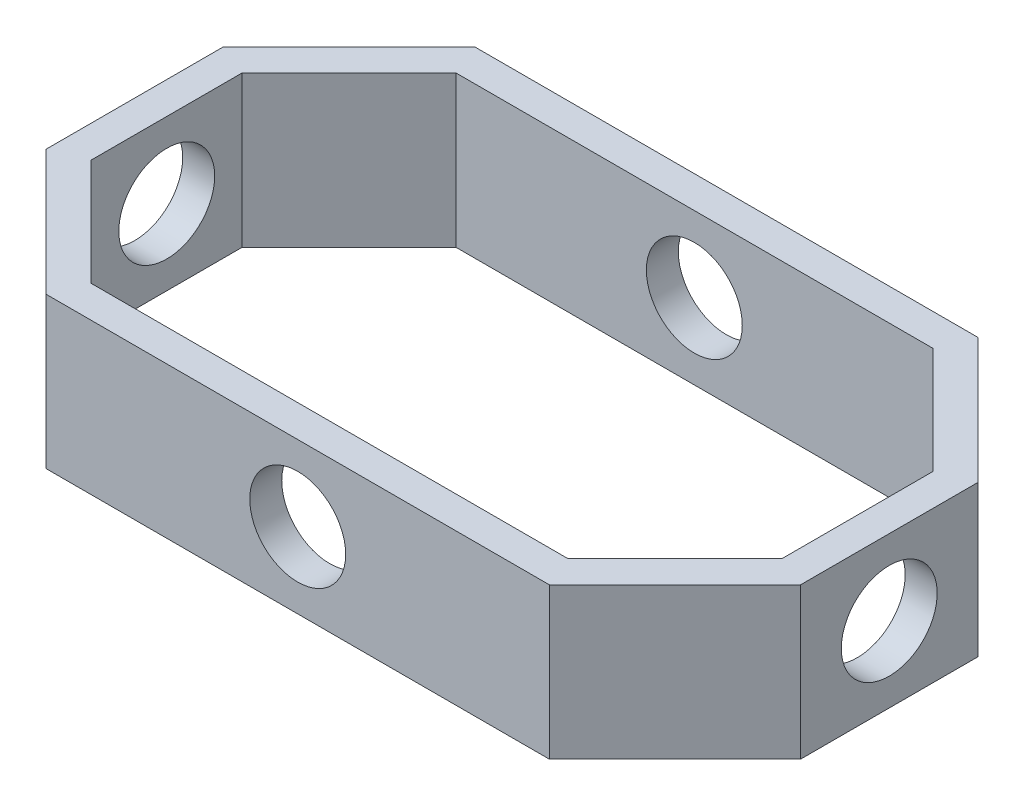
ISO-10303-21;
HEADER;
FILE_DESCRIPTION(('STEP AP214'),'2;1');
FILE_NAME('part.step','',(''),(''),'','','');
FILE_SCHEMA(('AUTOMOTIVE_DESIGN { 1 0 10303 214 1 1 1 1 }'));
ENDSEC;
DATA;
#1=APPLICATION_CONTEXT('core data for automotive mechanical design processes');
#2=APPLICATION_PROTOCOL_DEFINITION('international standard','automotive_design',2000,#1);
#3=PRODUCT_CONTEXT('',#1,'mechanical');
#4=PRODUCT('Part','Part','',(#3));
#5=PRODUCT_RELATED_PRODUCT_CATEGORY('part','',(#4));
#6=PRODUCT_DEFINITION_FORMATION('','',#4);
#7=PRODUCT_DEFINITION_CONTEXT('part definition',#1,'design');
#8=PRODUCT_DEFINITION('design','',#6,#7);
#9=PRODUCT_DEFINITION_SHAPE('','',#8);
#10=(LENGTH_UNIT() NAMED_UNIT(*) SI_UNIT(.MILLI.,.METRE.));
#11=(NAMED_UNIT(*) PLANE_ANGLE_UNIT() SI_UNIT($,.RADIAN.));
#12=(NAMED_UNIT(*) SI_UNIT($,.STERADIAN.) SOLID_ANGLE_UNIT());
#13=UNCERTAINTY_MEASURE_WITH_UNIT(LENGTH_MEASURE(1.E-05),#10,'distance_accuracy_value','');
#14=(GEOMETRIC_REPRESENTATION_CONTEXT(3) GLOBAL_UNCERTAINTY_ASSIGNED_CONTEXT((#13)) GLOBAL_UNIT_ASSIGNED_CONTEXT((#10,
#11,#12)) REPRESENTATION_CONTEXT('',''));
#15=CARTESIAN_POINT('',(0.,0.,0.));
#16=DIRECTION('',(0.,0.,1.));
#17=DIRECTION('',(1.,0.,0.));
#18=AXIS2_PLACEMENT_3D('',#15,#16,#17);
#19=CARTESIAN_POINT('',(0.,15.,0.));
#20=DIRECTION('',(0.,1.,0.));
#21=DIRECTION('',(0.,0.,1.));
#22=AXIS2_PLACEMENT_3D('',#19,#20,#21);
#23=PLANE('',#22);
#24=DIRECTION('',(-0.707106781186547,0.,0.707106781186548));
#25=VECTOR('',#24,1.);
#26=CARTESIAN_POINT('',(-25.,15.,-21.2816017177982));
#27=LINE('',#26,#25);
#28=CARTESIAN_POINT('',(-25.,15.,-21.2816017177982));
#29=VERTEX_POINT('',#28);
#30=CARTESIAN_POINT('',(-37.4664736572636,15.,-8.81512806053457));
#31=VERTEX_POINT('',#30);
#32=EDGE_CURVE('E244',#29,#31,#27,.T.);
#33=ORIENTED_EDGE('',*,*,#32,.T.);
#34=DIRECTION('',(0.,0.,1.));
#35=VECTOR('',#34,1.);
#36=CARTESIAN_POINT('',(-37.4664736572636,15.,-8.81512806053457));
#37=LINE('',#36,#35);
#38=CARTESIAN_POINT('',(-37.4664736572636,15.,8.81512806053458));
#39=VERTEX_POINT('',#38);
#40=EDGE_CURVE('E248',#31,#39,#37,.T.);
#41=ORIENTED_EDGE('',*,*,#40,.T.);
#42=DIRECTION('',(0.707106781186548,0.,0.707106781186547));
#43=VECTOR('',#42,1.);
#44=CARTESIAN_POINT('',(-37.4664736572636,15.,8.81512806053458));
#45=LINE('',#44,#43);
#46=CARTESIAN_POINT('',(-25.,15.,21.2816017177982));
#47=VERTEX_POINT('',#46);
#48=EDGE_CURVE('E252',#39,#47,#45,.T.);
#49=ORIENTED_EDGE('',*,*,#48,.T.);
#50=DIRECTION('',(1.,0.,0.));
#51=VECTOR('',#50,1.);
#52=CARTESIAN_POINT('',(-25.,15.,21.2816017177982));
#53=LINE('',#52,#51);
#54=CARTESIAN_POINT('',(25.,15.,21.2816017177982));
#55=VERTEX_POINT('',#54);
#56=EDGE_CURVE('E255',#47,#55,#53,.T.);
#57=ORIENTED_EDGE('',*,*,#56,.T.);
#58=DIRECTION('',(0.707106781186548,0.,-0.707106781186547));
#59=VECTOR('',#58,1.);
#60=CARTESIAN_POINT('',(25.,15.,21.2816017177982));
#61=LINE('',#60,#59);
#62=CARTESIAN_POINT('',(37.4664736572636,15.,8.81512806053457));
#63=VERTEX_POINT('',#62);
#64=EDGE_CURVE('E258',#55,#63,#61,.T.);
#65=ORIENTED_EDGE('',*,*,#64,.T.);
#66=DIRECTION('',(0.,0.,-1.));
#67=VECTOR('',#66,1.);
#68=CARTESIAN_POINT('',(37.4664736572636,15.,8.81512806053457));
#69=LINE('',#68,#67);
#70=CARTESIAN_POINT('',(37.4664736572636,15.,-8.81512806053457));
#71=VERTEX_POINT('',#70);
#72=EDGE_CURVE('E261',#63,#71,#69,.T.);
#73=ORIENTED_EDGE('',*,*,#72,.T.);
#74=DIRECTION('',(-0.707106781186548,0.,-0.707106781186547));
#75=VECTOR('',#74,1.);
#76=CARTESIAN_POINT('',(37.4664736572636,15.,-8.81512806053457));
#77=LINE('',#76,#75);
#78=CARTESIAN_POINT('',(25.,15.,-21.2816017177982));
#79=VERTEX_POINT('',#78);
#80=EDGE_CURVE('E264',#71,#79,#77,.T.);
#81=ORIENTED_EDGE('',*,*,#80,.T.);
#82=DIRECTION('',(-1.,0.,0.));
#83=VECTOR('',#82,1.);
#84=CARTESIAN_POINT('',(25.,15.,-21.2816017177982));
#85=LINE('',#84,#83);
#86=EDGE_CURVE('E267',#79,#29,#85,.T.);
#87=ORIENTED_EDGE('',*,*,#86,.T.);
#88=EDGE_LOOP('',(#33,#41,#49,#57,#65,#73,#81,#87));
#89=FACE_BOUND('',#88,.T.);
#90=DIRECTION('',(0.707106781186548,0.,0.707106781186547));
#91=VECTOR('',#90,1.);
#92=CARTESIAN_POINT('',(-34.2914736572636,15.,7.5));
#93=LINE('',#92,#91);
#94=CARTESIAN_POINT('',(-34.2914736572636,15.,7.5));
#95=VERTEX_POINT('',#94);
#96=CARTESIAN_POINT('',(-23.6848719394654,15.,18.1066017177982));
#97=VERTEX_POINT('',#96);
#98=EDGE_CURVE('E162',#95,#97,#93,.T.);
#99=ORIENTED_EDGE('',*,*,#98,.F.);
#100=DIRECTION('',(0.,0.,1.));
#101=VECTOR('',#100,1.);
#102=CARTESIAN_POINT('',(-34.2914736572636,15.,-7.49999999999999));
#103=LINE('',#102,#101);
#104=CARTESIAN_POINT('',(-34.2914736572636,15.,-7.49999999999999));
#105=VERTEX_POINT('',#104);
#106=EDGE_CURVE('E153',#105,#95,#103,.T.);
#107=ORIENTED_EDGE('',*,*,#106,.F.);
#108=DIRECTION('',(-0.707106781186547,0.,0.707106781186548));
#109=VECTOR('',#108,1.);
#110=CARTESIAN_POINT('',(-23.6848719394654,15.,-18.1066017177982));
#111=LINE('',#110,#109);
#112=CARTESIAN_POINT('',(-23.6848719394654,15.,-18.1066017177982));
#113=VERTEX_POINT('',#112);
#114=EDGE_CURVE('E195',#113,#105,#111,.T.);
#115=ORIENTED_EDGE('',*,*,#114,.F.);
#116=DIRECTION('',(-1.,0.,0.));
#117=VECTOR('',#116,1.);
#118=CARTESIAN_POINT('',(23.6848719394654,15.,-18.1066017177982));
#119=LINE('',#118,#117);
#120=CARTESIAN_POINT('',(23.6848719394654,15.,-18.1066017177982));
#121=VERTEX_POINT('',#120);
#122=EDGE_CURVE('E192',#121,#113,#119,.T.);
#123=ORIENTED_EDGE('',*,*,#122,.F.);
#124=DIRECTION('',(-0.707106781186548,0.,-0.707106781186547));
#125=VECTOR('',#124,1.);
#126=CARTESIAN_POINT('',(34.2914736572636,15.,-7.49999999999999));
#127=LINE('',#126,#125);
#128=CARTESIAN_POINT('',(34.2914736572636,15.,-7.49999999999999));
#129=VERTEX_POINT('',#128);
#130=EDGE_CURVE('E189',#129,#121,#127,.T.);
#131=ORIENTED_EDGE('',*,*,#130,.F.);
#132=DIRECTION('',(0.,0.,-1.));
#133=VECTOR('',#132,1.);
#134=CARTESIAN_POINT('',(34.2914736572636,15.,7.49999999999999));
#135=LINE('',#134,#133);
#136=CARTESIAN_POINT('',(34.2914736572636,15.,7.49999999999999));
#137=VERTEX_POINT('',#136);
#138=EDGE_CURVE('E186',#137,#129,#135,.T.);
#139=ORIENTED_EDGE('',*,*,#138,.F.);
#140=DIRECTION('',(0.707106781186548,0.,-0.707106781186548));
#141=VECTOR('',#140,1.);
#142=CARTESIAN_POINT('',(23.6848719394654,15.,18.1066017177982));
#143=LINE('',#142,#141);
#144=CARTESIAN_POINT('',(23.6848719394654,15.,18.1066017177982));
#145=VERTEX_POINT('',#144);
#146=EDGE_CURVE('E180',#145,#137,#143,.T.);
#147=ORIENTED_EDGE('',*,*,#146,.F.);
#148=DIRECTION('',(1.,0.,0.));
#149=VECTOR('',#148,1.);
#150=CARTESIAN_POINT('',(-23.6848719394654,15.,18.1066017177982));
#151=LINE('',#150,#149);
#152=EDGE_CURVE('E176',#97,#145,#151,.T.);
#153=ORIENTED_EDGE('',*,*,#152,.F.);
#154=EDGE_LOOP('',(#99,#107,#115,#123,#131,#139,#147,#153));
#155=FACE_BOUND('',#154,.T.);
#156=ADVANCED_FACE('F39',(#89,#155),#23,.T.);
#157=CARTESIAN_POINT('',(0.,0.,0.));
#158=DIRECTION('',(0.,1.,0.));
#159=DIRECTION('',(0.,0.,1.));
#160=AXIS2_PLACEMENT_3D('',#157,#158,#159);
#161=PLANE('',#160);
#162=DIRECTION('',(-0.707106781186547,0.,0.707106781186548));
#163=VECTOR('',#162,1.);
#164=CARTESIAN_POINT('',(-25.,0.,-21.2816017177982));
#165=LINE('',#164,#163);
#166=CARTESIAN_POINT('',(-25.,0.,-21.2816017177982));
#167=VERTEX_POINT('',#166);
#168=CARTESIAN_POINT('',(-37.4664736572636,0.,-8.81512806053457));
#169=VERTEX_POINT('',#168);
#170=EDGE_CURVE('E171',#167,#169,#165,.T.);
#171=ORIENTED_EDGE('',*,*,#170,.F.);
#172=DIRECTION('',(-1.,0.,0.));
#173=VECTOR('',#172,1.);
#174=CARTESIAN_POINT('',(25.,0.,-21.2816017177982));
#175=LINE('',#174,#173);
#176=CARTESIAN_POINT('',(25.,0.,-21.2816017177982));
#177=VERTEX_POINT('',#176);
#178=EDGE_CURVE('E249',#177,#167,#175,.T.);
#179=ORIENTED_EDGE('',*,*,#178,.F.);
#180=DIRECTION('',(-0.707106781186548,0.,-0.707106781186547));
#181=VECTOR('',#180,1.);
#182=CARTESIAN_POINT('',(37.4664736572636,0.,-8.81512806053457));
#183=LINE('',#182,#181);
#184=CARTESIAN_POINT('',(37.4664736572636,0.,-8.81512806053457));
#185=VERTEX_POINT('',#184);
#186=EDGE_CURVE('E289',#185,#177,#183,.T.);
#187=ORIENTED_EDGE('',*,*,#186,.F.);
#188=DIRECTION('',(0.,0.,-1.));
#189=VECTOR('',#188,1.);
#190=CARTESIAN_POINT('',(37.4664736572636,0.,8.81512806053457));
#191=LINE('',#190,#189);
#192=CARTESIAN_POINT('',(37.4664736572636,0.,8.81512806053457));
#193=VERTEX_POINT('',#192);
#194=EDGE_CURVE('E286',#193,#185,#191,.T.);
#195=ORIENTED_EDGE('',*,*,#194,.F.);
#196=DIRECTION('',(0.707106781186548,0.,-0.707106781186547));
#197=VECTOR('',#196,1.);
#198=CARTESIAN_POINT('',(25.,0.,21.2816017177982));
#199=LINE('',#198,#197);
#200=CARTESIAN_POINT('',(25.,0.,21.2816017177982));
#201=VERTEX_POINT('',#200);
#202=EDGE_CURVE('E283',#201,#193,#199,.T.);
#203=ORIENTED_EDGE('',*,*,#202,.F.);
#204=DIRECTION('',(1.,0.,0.));
#205=VECTOR('',#204,1.);
#206=CARTESIAN_POINT('',(-25.,0.,21.2816017177982));
#207=LINE('',#206,#205);
#208=CARTESIAN_POINT('',(-25.,0.,21.2816017177982));
#209=VERTEX_POINT('',#208);
#210=EDGE_CURVE('E280',#209,#201,#207,.T.);
#211=ORIENTED_EDGE('',*,*,#210,.F.);
#212=DIRECTION('',(0.707106781186548,0.,0.707106781186547));
#213=VECTOR('',#212,1.);
#214=CARTESIAN_POINT('',(-37.4664736572636,0.,8.81512806053458));
#215=LINE('',#214,#213);
#216=CARTESIAN_POINT('',(-37.4664736572636,0.,8.81512806053458));
#217=VERTEX_POINT('',#216);
#218=EDGE_CURVE('E277',#217,#209,#215,.T.);
#219=ORIENTED_EDGE('',*,*,#218,.F.);
#220=DIRECTION('',(0.,0.,1.));
#221=VECTOR('',#220,1.);
#222=CARTESIAN_POINT('',(-37.4664736572636,0.,-8.81512806053457));
#223=LINE('',#222,#221);
#224=EDGE_CURVE('E274',#169,#217,#223,.T.);
#225=ORIENTED_EDGE('',*,*,#224,.F.);
#226=EDGE_LOOP('',(#171,#179,#187,#195,#203,#211,#219,#225));
#227=FACE_BOUND('',#226,.T.);
#228=DIRECTION('',(0.,0.,1.));
#229=VECTOR('',#228,1.);
#230=CARTESIAN_POINT('',(-34.2914736572636,0.,-7.49999999999999));
#231=LINE('',#230,#229);
#232=CARTESIAN_POINT('',(-34.2914736572636,0.,-7.5));
#233=VERTEX_POINT('',#232);
#234=CARTESIAN_POINT('',(-34.2914736572636,0.,7.5));
#235=VERTEX_POINT('',#234);
#236=EDGE_CURVE('E63',#233,#235,#231,.T.);
#237=ORIENTED_EDGE('',*,*,#236,.T.);
#238=DIRECTION('',(0.707106781186548,0.,0.707106781186547));
#239=VECTOR('',#238,1.);
#240=CARTESIAN_POINT('',(-34.2914736572636,0.,7.5));
#241=LINE('',#240,#239);
#242=CARTESIAN_POINT('',(-23.6848719394654,0.,18.1066017177982));
#243=VERTEX_POINT('',#242);
#244=EDGE_CURVE('E169',#235,#243,#241,.T.);
#245=ORIENTED_EDGE('',*,*,#244,.T.);
#246=DIRECTION('',(1.,0.,0.));
#247=VECTOR('',#246,1.);
#248=CARTESIAN_POINT('',(-23.6848719394654,0.,18.1066017177982));
#249=LINE('',#248,#247);
#250=CARTESIAN_POINT('',(23.6848719394654,0.,18.1066017177982));
#251=VERTEX_POINT('',#250);
#252=EDGE_CURVE('E203',#243,#251,#249,.T.);
#253=ORIENTED_EDGE('',*,*,#252,.T.);
#254=DIRECTION('',(0.707106781186548,0.,-0.707106781186548));
#255=VECTOR('',#254,1.);
#256=CARTESIAN_POINT('',(23.6848719394654,0.,18.1066017177982));
#257=LINE('',#256,#255);
#258=CARTESIAN_POINT('',(34.2914736572636,0.,7.49999999999999));
#259=VERTEX_POINT('',#258);
#260=EDGE_CURVE('E207',#251,#259,#257,.T.);
#261=ORIENTED_EDGE('',*,*,#260,.T.);
#262=DIRECTION('',(0.,0.,-1.));
#263=VECTOR('',#262,1.);
#264=CARTESIAN_POINT('',(34.2914736572636,0.,7.49999999999999));
#265=LINE('',#264,#263);
#266=CARTESIAN_POINT('',(34.2914736572636,0.,-7.49999999999999));
#267=VERTEX_POINT('',#266);
#268=EDGE_CURVE('E211',#259,#267,#265,.T.);
#269=ORIENTED_EDGE('',*,*,#268,.T.);
#270=DIRECTION('',(-0.707106781186548,0.,-0.707106781186547));
#271=VECTOR('',#270,1.);
#272=CARTESIAN_POINT('',(34.2914736572636,0.,-7.49999999999999));
#273=LINE('',#272,#271);
#274=CARTESIAN_POINT('',(23.6848719394654,0.,-18.1066017177982));
#275=VERTEX_POINT('',#274);
#276=EDGE_CURVE('E215',#267,#275,#273,.T.);
#277=ORIENTED_EDGE('',*,*,#276,.T.);
#278=DIRECTION('',(-1.,0.,0.));
#279=VECTOR('',#278,1.);
#280=CARTESIAN_POINT('',(23.6848719394654,0.,-18.1066017177982));
#281=LINE('',#280,#279);
#282=CARTESIAN_POINT('',(-23.6848719394654,0.,-18.1066017177982));
#283=VERTEX_POINT('',#282);
#284=EDGE_CURVE('E219',#275,#283,#281,.T.);
#285=ORIENTED_EDGE('',*,*,#284,.T.);
#286=DIRECTION('',(-0.707106781186547,0.,0.707106781186548));
#287=VECTOR('',#286,1.);
#288=CARTESIAN_POINT('',(-23.6848719394654,0.,-18.1066017177982));
#289=LINE('',#288,#287);
#290=EDGE_CURVE('E163',#283,#233,#289,.T.);
#291=ORIENTED_EDGE('',*,*,#290,.T.);
#292=EDGE_LOOP('',(#237,#245,#253,#261,#269,#277,#285,#291));
#293=FACE_BOUND('',#292,.T.);
#294=ADVANCED_FACE('F328',(#227,#293),#161,.F.);
#295=CARTESIAN_POINT('',(-25.,15.,-21.2816017177982));
#296=DIRECTION('',(0.707106781186548,0.,0.707106781186547));
#297=DIRECTION('',(0.707106781186547,0.,-0.707106781186548));
#298=AXIS2_PLACEMENT_3D('',#295,#296,#297);
#299=PLANE('',#298);
#300=ORIENTED_EDGE('',*,*,#170,.T.);
#301=DIRECTION('',(0.,-1.,0.));
#302=VECTOR('',#301,1.);
#303=CARTESIAN_POINT('',(-37.4664736572636,15.,-8.81512806053457));
#304=LINE('',#303,#302);
#305=EDGE_CURVE('E11',#31,#169,#304,.T.);
#306=ORIENTED_EDGE('',*,*,#305,.F.);
#307=ORIENTED_EDGE('',*,*,#32,.F.);
#308=DIRECTION('',(0.,-1.,0.));
#309=VECTOR('',#308,1.);
#310=CARTESIAN_POINT('',(-25.,15.,-21.2816017177982));
#311=LINE('',#310,#309);
#312=EDGE_CURVE('E270',#29,#167,#311,.T.);
#313=ORIENTED_EDGE('',*,*,#312,.T.);
#314=EDGE_LOOP('',(#300,#306,#307,#313));
#315=FACE_BOUND('',#314,.T.);
#316=ADVANCED_FACE('F41',(#315),#299,.F.);
#317=CARTESIAN_POINT('',(-37.4664736572636,15.,-8.81512806053457));
#318=DIRECTION('',(1.,0.,0.));
#319=DIRECTION('',(0.,0.,-1.));
#320=AXIS2_PLACEMENT_3D('',#317,#318,#319);
#321=PLANE('',#320);
#322=CARTESIAN_POINT('',(-37.4664736572636,7.5,1.30813493606594E-13));
#323=DIRECTION('',(1.,0.,0.));
#324=DIRECTION('',(0.,0.,-1.));
#325=AXIS2_PLACEMENT_3D('',#322,#323,#324);
#326=CIRCLE('',#325,4.7625);
#327=CARTESIAN_POINT('',(-37.4664736572636,7.5,-4.76249999999987));
#328=VERTEX_POINT('',#327);
#329=EDGE_CURVE('E395',#328,#328,#326,.F.);
#330=ORIENTED_EDGE('',*,*,#329,.F.);
#331=EDGE_LOOP('',(#330));
#332=FACE_BOUND('',#331,.T.);
#333=ORIENTED_EDGE('',*,*,#224,.T.);
#334=DIRECTION('',(0.,-1.,0.));
#335=VECTOR('',#334,1.);
#336=CARTESIAN_POINT('',(-37.4664736572636,15.,8.81512806053458));
#337=LINE('',#336,#335);
#338=EDGE_CURVE('E48',#39,#217,#337,.T.);
#339=ORIENTED_EDGE('',*,*,#338,.F.);
#340=ORIENTED_EDGE('',*,*,#40,.F.);
#341=ORIENTED_EDGE('',*,*,#305,.T.);
#342=EDGE_LOOP('',(#333,#339,#340,#341));
#343=FACE_BOUND('',#342,.T.);
#344=ADVANCED_FACE('F345',(#332,#343),#321,.F.);
#345=CARTESIAN_POINT('',(-37.4664736572636,15.,8.81512806053458));
#346=DIRECTION('',(0.707106781186547,0.,-0.707106781186548));
#347=DIRECTION('',(-0.707106781186548,0.,-0.707106781186547));
#348=AXIS2_PLACEMENT_3D('',#345,#346,#347);
#349=PLANE('',#348);
#350=ORIENTED_EDGE('',*,*,#218,.T.);
#351=DIRECTION('',(0.,-1.,0.));
#352=VECTOR('',#351,1.);
#353=CARTESIAN_POINT('',(-25.,15.,21.2816017177982));
#354=LINE('',#353,#352);
#355=EDGE_CURVE('E313',#47,#209,#354,.T.);
#356=ORIENTED_EDGE('',*,*,#355,.F.);
#357=ORIENTED_EDGE('',*,*,#48,.F.);
#358=ORIENTED_EDGE('',*,*,#338,.T.);
#359=EDGE_LOOP('',(#350,#356,#357,#358));
#360=FACE_BOUND('',#359,.T.);
#361=ADVANCED_FACE('F322',(#360),#349,.F.);
#362=CARTESIAN_POINT('',(-25.,15.,21.2816017177982));
#363=DIRECTION('',(0.,0.,-1.));
#364=DIRECTION('',(-1.,0.,0.));
#365=AXIS2_PLACEMENT_3D('',#362,#363,#364);
#366=PLANE('',#365);
#367=CARTESIAN_POINT('',(0.,7.5,21.2816017177982));
#368=DIRECTION('',(0.,0.,1.));
#369=DIRECTION('',(1.,0.,0.));
#370=AXIS2_PLACEMENT_3D('',#367,#368,#369);
#371=CIRCLE('',#370,4.7625);
#372=CARTESIAN_POINT('',(4.7625,7.5,21.2816017177982));
#373=VERTEX_POINT('',#372);
#374=EDGE_CURVE('E200',#373,#373,#371,.T.);
#375=ORIENTED_EDGE('',*,*,#374,.F.);
#376=EDGE_LOOP('',(#375));
#377=FACE_BOUND('',#376,.T.);
#378=ORIENTED_EDGE('',*,*,#210,.T.);
#379=DIRECTION('',(0.,-1.,0.));
#380=VECTOR('',#379,1.);
#381=CARTESIAN_POINT('',(25.,15.,21.2816017177982));
#382=LINE('',#381,#380);
#383=EDGE_CURVE('E309',#55,#201,#382,.T.);
#384=ORIENTED_EDGE('',*,*,#383,.F.);
#385=ORIENTED_EDGE('',*,*,#56,.F.);
#386=ORIENTED_EDGE('',*,*,#355,.T.);
#387=EDGE_LOOP('',(#378,#384,#385,#386));
#388=FACE_BOUND('',#387,.T.);
#389=ADVANCED_FACE('F334',(#377,#388),#366,.F.);
#390=CARTESIAN_POINT('',(25.,15.,21.2816017177982));
#391=DIRECTION('',(-0.707106781186547,0.,-0.707106781186548));
#392=DIRECTION('',(-0.707106781186548,0.,0.707106781186547));
#393=AXIS2_PLACEMENT_3D('',#390,#391,#392);
#394=PLANE('',#393);
#395=ORIENTED_EDGE('',*,*,#202,.T.);
#396=DIRECTION('',(0.,-1.,0.));
#397=VECTOR('',#396,1.);
#398=CARTESIAN_POINT('',(37.4664736572636,15.,8.81512806053457));
#399=LINE('',#398,#397);
#400=EDGE_CURVE('E305',#63,#193,#399,.T.);
#401=ORIENTED_EDGE('',*,*,#400,.F.);
#402=ORIENTED_EDGE('',*,*,#64,.F.);
#403=ORIENTED_EDGE('',*,*,#383,.T.);
#404=EDGE_LOOP('',(#395,#401,#402,#403));
#405=FACE_BOUND('',#404,.T.);
#406=ADVANCED_FACE('F338',(#405),#394,.F.);
#407=CARTESIAN_POINT('',(37.4664736572636,15.,8.81512806053457));
#408=DIRECTION('',(-1.,0.,0.));
#409=DIRECTION('',(0.,0.,1.));
#410=AXIS2_PLACEMENT_3D('',#407,#408,#409);
#411=PLANE('',#410);
#412=CARTESIAN_POINT('',(37.4664736572636,7.5,-3.92440480819781E-13));
#413=DIRECTION('',(-1.,0.,0.));
#414=DIRECTION('',(0.,0.,1.));
#415=AXIS2_PLACEMENT_3D('',#412,#413,#414);
#416=CIRCLE('',#415,4.7625);
#417=CARTESIAN_POINT('',(37.4664736572636,7.5,4.76249999999961));
#418=VERTEX_POINT('',#417);
#419=EDGE_CURVE('E398',#418,#418,#416,.F.);
#420=ORIENTED_EDGE('',*,*,#419,.F.);
#421=EDGE_LOOP('',(#420));
#422=FACE_BOUND('',#421,.T.);
#423=ORIENTED_EDGE('',*,*,#194,.T.);
#424=DIRECTION('',(0.,-1.,0.));
#425=VECTOR('',#424,1.);
#426=CARTESIAN_POINT('',(37.4664736572636,15.,-8.81512806053457));
#427=LINE('',#426,#425);
#428=EDGE_CURVE('E301',#71,#185,#427,.T.);
#429=ORIENTED_EDGE('',*,*,#428,.F.);
#430=ORIENTED_EDGE('',*,*,#72,.F.);
#431=ORIENTED_EDGE('',*,*,#400,.T.);
#432=EDGE_LOOP('',(#423,#429,#430,#431));
#433=FACE_BOUND('',#432,.T.);
#434=ADVANCED_FACE('F358',(#422,#433),#411,.F.);
#435=CARTESIAN_POINT('',(37.4664736572636,15.,-8.81512806053457));
#436=DIRECTION('',(-0.707106781186547,0.,0.707106781186548));
#437=DIRECTION('',(0.707106781186548,0.,0.707106781186547));
#438=AXIS2_PLACEMENT_3D('',#435,#436,#437);
#439=PLANE('',#438);
#440=ORIENTED_EDGE('',*,*,#186,.T.);
#441=DIRECTION('',(0.,-1.,0.));
#442=VECTOR('',#441,1.);
#443=CARTESIAN_POINT('',(25.,15.,-21.2816017177982));
#444=LINE('',#443,#442);
#445=EDGE_CURVE('E297',#79,#177,#444,.T.);
#446=ORIENTED_EDGE('',*,*,#445,.F.);
#447=ORIENTED_EDGE('',*,*,#80,.F.);
#448=ORIENTED_EDGE('',*,*,#428,.T.);
#449=EDGE_LOOP('',(#440,#446,#447,#448));
#450=FACE_BOUND('',#449,.T.);
#451=ADVANCED_FACE('F356',(#450),#439,.F.);
#452=CARTESIAN_POINT('',(25.,15.,-21.2816017177982));
#453=DIRECTION('',(0.,0.,1.));
#454=DIRECTION('',(1.,0.,0.));
#455=AXIS2_PLACEMENT_3D('',#452,#453,#454);
#456=PLANE('',#455);
#457=CARTESIAN_POINT('',(0.,7.5,-21.2816017177982));
#458=DIRECTION('',(0.,0.,-1.));
#459=DIRECTION('',(-1.,0.,0.));
#460=AXIS2_PLACEMENT_3D('',#457,#458,#459);
#461=CIRCLE('',#460,4.7625);
#462=CARTESIAN_POINT('',(-4.7625,7.5,-21.2816017177982));
#463=VERTEX_POINT('',#462);
#464=EDGE_CURVE('E386',#463,#463,#461,.T.);
#465=ORIENTED_EDGE('',*,*,#464,.F.);
#466=EDGE_LOOP('',(#465));
#467=FACE_BOUND('',#466,.T.);
#468=ORIENTED_EDGE('',*,*,#178,.T.);
#469=ORIENTED_EDGE('',*,*,#312,.F.);
#470=ORIENTED_EDGE('',*,*,#86,.F.);
#471=ORIENTED_EDGE('',*,*,#445,.T.);
#472=EDGE_LOOP('',(#468,#469,#470,#471));
#473=FACE_BOUND('',#472,.T.);
#474=ADVANCED_FACE('F351',(#467,#473),#456,.F.);
#475=CARTESIAN_POINT('',(-34.2914736572636,15.,-7.49999999999999));
#476=DIRECTION('',(1.,0.,0.));
#477=DIRECTION('',(0.,0.,-1.));
#478=AXIS2_PLACEMENT_3D('',#475,#476,#477);
#479=PLANE('',#478);
#480=CARTESIAN_POINT('',(-34.2914736572636,7.5,1.19728040355767E-13));
#481=DIRECTION('',(1.,0.,0.));
#482=DIRECTION('',(0.,0.,-1.));
#483=AXIS2_PLACEMENT_3D('',#480,#481,#482);
#484=CIRCLE('',#483,4.7625);
#485=CARTESIAN_POINT('',(-34.2914736572636,7.5,-4.76249999999988));
#486=VERTEX_POINT('',#485);
#487=EDGE_CURVE('E389',#486,#486,#484,.F.);
#488=ORIENTED_EDGE('',*,*,#487,.T.);
#489=EDGE_LOOP('',(#488));
#490=FACE_BOUND('',#489,.T.);
#491=ORIENTED_EDGE('',*,*,#236,.F.);
#492=DIRECTION('',(0.,-1.,0.));
#493=VECTOR('',#492,1.);
#494=CARTESIAN_POINT('',(-34.2914736572636,15.,-7.49999999999999));
#495=LINE('',#494,#493);
#496=EDGE_CURVE('E157',#105,#233,#495,.T.);
#497=ORIENTED_EDGE('',*,*,#496,.F.);
#498=ORIENTED_EDGE('',*,*,#106,.T.);
#499=DIRECTION('',(0.,-1.,0.));
#500=VECTOR('',#499,1.);
#501=CARTESIAN_POINT('',(-34.2914736572636,15.,7.5));
#502=LINE('',#501,#500);
#503=EDGE_CURVE('E156',#95,#235,#502,.T.);
#504=ORIENTED_EDGE('',*,*,#503,.T.);
#505=EDGE_LOOP('',(#491,#497,#498,#504));
#506=FACE_BOUND('',#505,.T.);
#507=ADVANCED_FACE('F155',(#490,#506),#479,.T.);
#508=CARTESIAN_POINT('',(-34.2914736572636,15.,7.5));
#509=DIRECTION('',(0.707106781186547,0.,-0.707106781186548));
#510=DIRECTION('',(-0.707106781186548,0.,-0.707106781186547));
#511=AXIS2_PLACEMENT_3D('',#508,#509,#510);
#512=PLANE('',#511);
#513=ORIENTED_EDGE('',*,*,#244,.F.);
#514=ORIENTED_EDGE('',*,*,#503,.F.);
#515=ORIENTED_EDGE('',*,*,#98,.T.);
#516=DIRECTION('',(0.,-1.,0.));
#517=VECTOR('',#516,1.);
#518=CARTESIAN_POINT('',(-23.6848719394654,15.,18.1066017177982));
#519=LINE('',#518,#517);
#520=EDGE_CURVE('E172',#97,#243,#519,.T.);
#521=ORIENTED_EDGE('',*,*,#520,.T.);
#522=EDGE_LOOP('',(#513,#514,#515,#521));
#523=FACE_BOUND('',#522,.T.);
#524=ADVANCED_FACE('F166',(#523),#512,.T.);
#525=CARTESIAN_POINT('',(-23.6848719394654,15.,18.1066017177982));
#526=DIRECTION('',(0.,0.,-1.));
#527=DIRECTION('',(-1.,0.,0.));
#528=AXIS2_PLACEMENT_3D('',#525,#526,#527);
#529=PLANE('',#528);
#530=CARTESIAN_POINT('',(0.,7.5,18.1066017177982));
#531=DIRECTION('',(0.,0.,-1.));
#532=DIRECTION('',(-1.,0.,0.));
#533=AXIS2_PLACEMENT_3D('',#530,#531,#532);
#534=CIRCLE('',#533,4.7625);
#535=CARTESIAN_POINT('',(-4.7625,7.5,18.1066017177982));
#536=VERTEX_POINT('',#535);
#537=EDGE_CURVE('E409',#536,#536,#534,.F.);
#538=ORIENTED_EDGE('',*,*,#537,.T.);
#539=EDGE_LOOP('',(#538));
#540=FACE_BOUND('',#539,.T.);
#541=ORIENTED_EDGE('',*,*,#252,.F.);
#542=ORIENTED_EDGE('',*,*,#520,.F.);
#543=ORIENTED_EDGE('',*,*,#152,.T.);
#544=DIRECTION('',(0.,-1.,0.));
#545=VECTOR('',#544,1.);
#546=CARTESIAN_POINT('',(23.6848719394654,15.,18.1066017177982));
#547=LINE('',#546,#545);
#548=EDGE_CURVE('E239',#145,#251,#547,.T.);
#549=ORIENTED_EDGE('',*,*,#548,.T.);
#550=EDGE_LOOP('',(#541,#542,#543,#549));
#551=FACE_BOUND('',#550,.T.);
#552=ADVANCED_FACE('F470',(#540,#551),#529,.T.);
#553=CARTESIAN_POINT('',(23.6848719394654,15.,18.1066017177982));
#554=DIRECTION('',(-0.707106781186548,0.,-0.707106781186547));
#555=DIRECTION('',(-0.707106781186547,0.,0.707106781186548));
#556=AXIS2_PLACEMENT_3D('',#553,#554,#555);
#557=PLANE('',#556);
#558=ORIENTED_EDGE('',*,*,#260,.F.);
#559=ORIENTED_EDGE('',*,*,#548,.F.);
#560=ORIENTED_EDGE('',*,*,#146,.T.);
#561=DIRECTION('',(0.,-1.,0.));
#562=VECTOR('',#561,1.);
#563=CARTESIAN_POINT('',(34.2914736572636,15.,7.49999999999999));
#564=LINE('',#563,#562);
#565=EDGE_CURVE('E236',#137,#259,#564,.T.);
#566=ORIENTED_EDGE('',*,*,#565,.T.);
#567=EDGE_LOOP('',(#558,#559,#560,#566));
#568=FACE_BOUND('',#567,.T.);
#569=ADVANCED_FACE('F466',(#568),#557,.T.);
#570=CARTESIAN_POINT('',(34.2914736572636,15.,7.49999999999999));
#571=DIRECTION('',(-1.,0.,0.));
#572=DIRECTION('',(0.,0.,1.));
#573=AXIS2_PLACEMENT_3D('',#570,#571,#572);
#574=PLANE('',#573);
#575=CARTESIAN_POINT('',(34.2914736572636,7.5,-3.59184121067301E-13));
#576=DIRECTION('',(-1.,0.,0.));
#577=DIRECTION('',(0.,0.,1.));
#578=AXIS2_PLACEMENT_3D('',#575,#576,#577);
#579=CIRCLE('',#578,4.7625);
#580=CARTESIAN_POINT('',(34.2914736572636,7.5,4.76249999999964));
#581=VERTEX_POINT('',#580);
#582=EDGE_CURVE('E402',#581,#581,#579,.F.);
#583=ORIENTED_EDGE('',*,*,#582,.T.);
#584=EDGE_LOOP('',(#583));
#585=FACE_BOUND('',#584,.T.);
#586=ORIENTED_EDGE('',*,*,#268,.F.);
#587=ORIENTED_EDGE('',*,*,#565,.F.);
#588=ORIENTED_EDGE('',*,*,#138,.T.);
#589=DIRECTION('',(0.,-1.,0.));
#590=VECTOR('',#589,1.);
#591=CARTESIAN_POINT('',(34.2914736572636,15.,-7.49999999999999));
#592=LINE('',#591,#590);
#593=EDGE_CURVE('E233',#129,#267,#592,.T.);
#594=ORIENTED_EDGE('',*,*,#593,.T.);
#595=EDGE_LOOP('',(#586,#587,#588,#594));
#596=FACE_BOUND('',#595,.T.);
#597=ADVANCED_FACE('F462',(#585,#596),#574,.T.);
#598=CARTESIAN_POINT('',(34.2914736572636,15.,-7.49999999999999));
#599=DIRECTION('',(-0.707106781186547,0.,0.707106781186548));
#600=DIRECTION('',(0.707106781186548,0.,0.707106781186547));
#601=AXIS2_PLACEMENT_3D('',#598,#599,#600);
#602=PLANE('',#601);
#603=ORIENTED_EDGE('',*,*,#276,.F.);
#604=ORIENTED_EDGE('',*,*,#593,.F.);
#605=ORIENTED_EDGE('',*,*,#130,.T.);
#606=DIRECTION('',(0.,-1.,0.));
#607=VECTOR('',#606,1.);
#608=CARTESIAN_POINT('',(23.6848719394654,15.,-18.1066017177982));
#609=LINE('',#608,#607);
#610=EDGE_CURVE('E230',#121,#275,#609,.T.);
#611=ORIENTED_EDGE('',*,*,#610,.T.);
#612=EDGE_LOOP('',(#603,#604,#605,#611));
#613=FACE_BOUND('',#612,.T.);
#614=ADVANCED_FACE('F458',(#613),#602,.T.);
#615=CARTESIAN_POINT('',(23.6848719394654,15.,-18.1066017177982));
#616=DIRECTION('',(0.,0.,1.));
#617=DIRECTION('',(1.,0.,0.));
#618=AXIS2_PLACEMENT_3D('',#615,#616,#617);
#619=PLANE('',#618);
#620=CARTESIAN_POINT('',(0.,7.5,-18.1066017177982));
#621=DIRECTION('',(0.,0.,1.));
#622=DIRECTION('',(1.,0.,0.));
#623=AXIS2_PLACEMENT_3D('',#620,#621,#622);
#624=CIRCLE('',#623,4.7625);
#625=CARTESIAN_POINT('',(4.7625,7.5,-18.1066017177982));
#626=VERTEX_POINT('',#625);
#627=EDGE_CURVE('E390',#626,#626,#624,.F.);
#628=ORIENTED_EDGE('',*,*,#627,.T.);
#629=EDGE_LOOP('',(#628));
#630=FACE_BOUND('',#629,.T.);
#631=ORIENTED_EDGE('',*,*,#284,.F.);
#632=ORIENTED_EDGE('',*,*,#610,.F.);
#633=ORIENTED_EDGE('',*,*,#122,.T.);
#634=DIRECTION('',(0.,-1.,0.));
#635=VECTOR('',#634,1.);
#636=CARTESIAN_POINT('',(-23.6848719394654,15.,-18.1066017177982));
#637=LINE('',#636,#635);
#638=EDGE_CURVE('E55',#113,#283,#637,.T.);
#639=ORIENTED_EDGE('',*,*,#638,.T.);
#640=EDGE_LOOP('',(#631,#632,#633,#639));
#641=FACE_BOUND('',#640,.T.);
#642=ADVANCED_FACE('F455',(#630,#641),#619,.T.);
#643=CARTESIAN_POINT('',(-23.6848719394654,15.,-18.1066017177982));
#644=DIRECTION('',(0.707106781186548,0.,0.707106781186547));
#645=DIRECTION('',(0.707106781186547,0.,-0.707106781186548));
#646=AXIS2_PLACEMENT_3D('',#643,#644,#645);
#647=PLANE('',#646);
#648=ORIENTED_EDGE('',*,*,#290,.F.);
#649=ORIENTED_EDGE('',*,*,#638,.F.);
#650=ORIENTED_EDGE('',*,*,#114,.T.);
#651=ORIENTED_EDGE('',*,*,#496,.T.);
#652=EDGE_LOOP('',(#648,#649,#650,#651));
#653=FACE_BOUND('',#652,.T.);
#654=ADVANCED_FACE('F451',(#653),#647,.T.);
#655=CARTESIAN_POINT('',(0.,7.5,-21.2826017177982));
#656=DIRECTION('',(0.,0.,1.));
#657=DIRECTION('',(1.,0.,0.));
#658=AXIS2_PLACEMENT_3D('',#655,#656,#657);
#659=CYLINDRICAL_SURFACE('',#658,4.7625);
#660=ORIENTED_EDGE('',*,*,#537,.F.);
#661=EDGE_LOOP('',(#660));
#662=FACE_BOUND('',#661,.T.);
#663=ORIENTED_EDGE('',*,*,#374,.T.);
#664=EDGE_LOOP('',(#663));
#665=FACE_BOUND('',#664,.T.);
#666=ADVANCED_FACE('F416',(#662,#665),#659,.F.);
#667=CARTESIAN_POINT('',(0.,7.5,21.2826017177982));
#668=DIRECTION('',(0.,0.,-1.));
#669=DIRECTION('',(-1.,0.,0.));
#670=AXIS2_PLACEMENT_3D('',#667,#668,#669);
#671=CYLINDRICAL_SURFACE('',#670,4.7625);
#672=ORIENTED_EDGE('',*,*,#627,.F.);
#673=EDGE_LOOP('',(#672));
#674=FACE_BOUND('',#673,.T.);
#675=ORIENTED_EDGE('',*,*,#464,.T.);
#676=EDGE_LOOP('',(#675));
#677=FACE_BOUND('',#676,.T.);
#678=ADVANCED_FACE('F441',(#674,#677),#671,.F.);
#679=CARTESIAN_POINT('',(37.4674736572639,7.5,-3.924509552638E-13));
#680=DIRECTION('',(-1.,0.,0.));
#681=DIRECTION('',(0.,0.,1.));
#682=AXIS2_PLACEMENT_3D('',#679,#680,#681);
#683=CYLINDRICAL_SURFACE('',#682,4.7625);
#684=ORIENTED_EDGE('',*,*,#582,.F.);
#685=EDGE_LOOP('',(#684));
#686=FACE_BOUND('',#685,.T.);
#687=ORIENTED_EDGE('',*,*,#419,.T.);
#688=EDGE_LOOP('',(#687));
#689=FACE_BOUND('',#688,.T.);
#690=ADVANCED_FACE('F435',(#686,#689),#683,.F.);
#691=CARTESIAN_POINT('',(-37.4674736572637,7.5,1.30816985087933E-13));
#692=DIRECTION('',(1.,0.,0.));
#693=DIRECTION('',(0.,0.,-1.));
#694=AXIS2_PLACEMENT_3D('',#691,#692,#693);
#695=CYLINDRICAL_SURFACE('',#694,4.7625);
#696=ORIENTED_EDGE('',*,*,#487,.F.);
#697=EDGE_LOOP('',(#696));
#698=FACE_BOUND('',#697,.T.);
#699=ORIENTED_EDGE('',*,*,#329,.T.);
#700=EDGE_LOOP('',(#699));
#701=FACE_BOUND('',#700,.T.);
#702=ADVANCED_FACE('F433',(#698,#701),#695,.F.);
#703=CLOSED_SHELL('',(#156,#294,#316,#344,#361,#389,#406,#434,#451,#474,#507,#524,#552,#569,
#597,#614,#642,#654,#666,#678,#690,#702));
#704=MANIFOLD_SOLID_BREP('B2',#703);
#705=ADVANCED_BREP_SHAPE_REPRESENTATION('',(#18,#704),#14);
#706=SHAPE_DEFINITION_REPRESENTATION(#9,#705);
ENDSEC;
END-ISO-10303-21;
